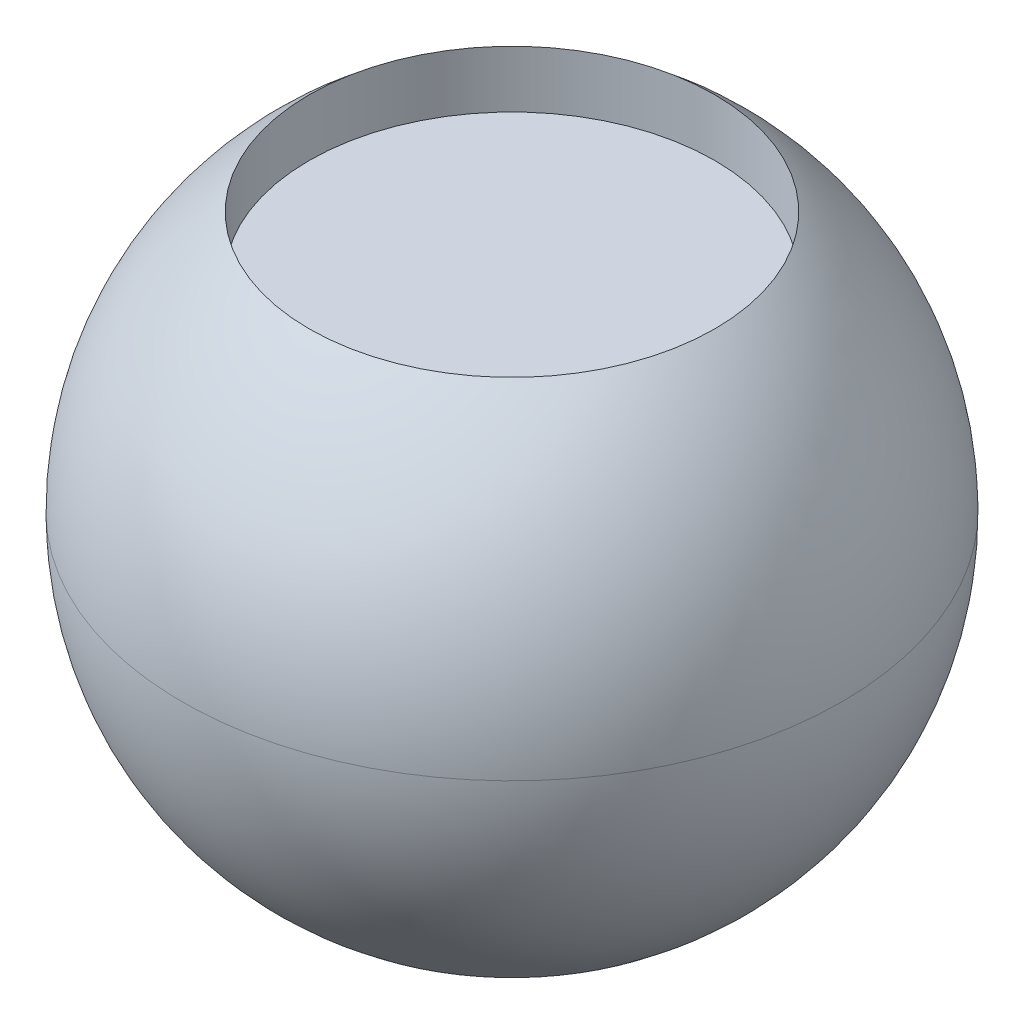
ISO-10303-21;
HEADER;
FILE_DESCRIPTION(('STEP AP214'),'2;1');
FILE_NAME('part.step','',(''),(''),'','','');
FILE_SCHEMA(('AUTOMOTIVE_DESIGN { 1 0 10303 214 1 1 1 1 }'));
ENDSEC;
DATA;
#1=APPLICATION_CONTEXT('core data for automotive mechanical design processes');
#2=APPLICATION_PROTOCOL_DEFINITION('international standard','automotive_design',2000,#1);
#3=PRODUCT_CONTEXT('',#1,'mechanical');
#4=PRODUCT('Part','Part','',(#3));
#5=PRODUCT_RELATED_PRODUCT_CATEGORY('part','',(#4));
#6=PRODUCT_DEFINITION_FORMATION('','',#4);
#7=PRODUCT_DEFINITION_CONTEXT('part definition',#1,'design');
#8=PRODUCT_DEFINITION('design','',#6,#7);
#9=PRODUCT_DEFINITION_SHAPE('','',#8);
#10=(LENGTH_UNIT() NAMED_UNIT(*) SI_UNIT(.MILLI.,.METRE.));
#11=(NAMED_UNIT(*) PLANE_ANGLE_UNIT() SI_UNIT($,.RADIAN.));
#12=(NAMED_UNIT(*) SI_UNIT($,.STERADIAN.) SOLID_ANGLE_UNIT());
#13=UNCERTAINTY_MEASURE_WITH_UNIT(LENGTH_MEASURE(1.E-05),#10,'distance_accuracy_value','');
#14=(GEOMETRIC_REPRESENTATION_CONTEXT(3) GLOBAL_UNCERTAINTY_ASSIGNED_CONTEXT((#13)) GLOBAL_UNIT_ASSIGNED_CONTEXT((#10,
#11,#12)) REPRESENTATION_CONTEXT('',''));
#15=CARTESIAN_POINT('',(0.,0.,0.));
#16=DIRECTION('',(0.,0.,1.));
#17=DIRECTION('',(1.,0.,0.));
#18=AXIS2_PLACEMENT_3D('',#15,#16,#17);
#19=CARTESIAN_POINT('',(-37.5,0.,-32.51));
#20=DIRECTION('',(0.,-1.,0.));
#21=DIRECTION('',(1.,0.,0.));
#22=AXIS2_PLACEMENT_3D('',#19,#20,#21);
#23=PLANE('',#22);
#24=CARTESIAN_POINT('',(0.,0.,0.));
#25=DIRECTION('',(0.,-1.,0.));
#26=DIRECTION('',(1.,0.,0.));
#27=AXIS2_PLACEMENT_3D('',#24,#25,#26);
#28=CIRCLE('',#27,32.5);
#29=CARTESIAN_POINT('',(32.5,0.,0.));
#30=VERTEX_POINT('',#29);
#31=EDGE_CURVE('E53',#30,#30,#28,.T.);
#32=ORIENTED_EDGE('',*,*,#31,.T.);
#33=EDGE_LOOP('',(#32));
#34=FACE_BOUND('',#33,.T.);
#35=CARTESIAN_POINT('',(0.,0.,0.));
#36=DIRECTION('',(0.,-1.,0.));
#37=DIRECTION('',(1.,0.,0.));
#38=AXIS2_PLACEMENT_3D('',#35,#36,#37);
#39=CIRCLE('',#38,29.5);
#40=CARTESIAN_POINT('',(29.5,0.,0.));
#41=VERTEX_POINT('',#40);
#42=EDGE_CURVE('E67',#41,#41,#39,.T.);
#43=ORIENTED_EDGE('',*,*,#42,.F.);
#44=EDGE_LOOP('',(#43));
#45=FACE_BOUND('',#44,.T.);
#46=ADVANCED_FACE('F49',(#34,#45),#23,.T.);
#47=CARTESIAN_POINT('',(0.,17.,0.));
#48=DIRECTION('',(0.,1.,0.));
#49=DIRECTION('',(0.,0.,1.));
#50=AXIS2_PLACEMENT_3D('',#47,#48,#49);
#51=PLANE('',#50);
#52=CARTESIAN_POINT('',(0.,17.,0.));
#53=DIRECTION('',(0.,1.,0.));
#54=DIRECTION('',(0.,0.,1.));
#55=AXIS2_PLACEMENT_3D('',#52,#53,#54);
#56=CIRCLE('',#55,23.);
#57=CARTESIAN_POINT('',(0.,17.,23.));
#58=VERTEX_POINT('',#57);
#59=EDGE_CURVE('E70',#58,#58,#56,.T.);
#60=ORIENTED_EDGE('',*,*,#59,.F.);
#61=EDGE_LOOP('',(#60));
#62=FACE_BOUND('',#61,.T.);
#63=ADVANCED_FACE('F94',(#62),#51,.F.);
#64=CARTESIAN_POINT('',(0.,20.,0.));
#65=DIRECTION('',(0.,1.,0.));
#66=DIRECTION('',(0.,0.,1.));
#67=AXIS2_PLACEMENT_3D('',#64,#65,#66);
#68=CYLINDRICAL_SURFACE('',#67,23.);
#69=ORIENTED_EDGE('',*,*,#59,.T.);
#70=EDGE_LOOP('',(#69));
#71=FACE_BOUND('',#70,.T.);
#72=CARTESIAN_POINT('',(0.,18.4729532019112,0.));
#73=DIRECTION('',(0.,-1.,0.));
#74=DIRECTION('',(0.,0.,-1.));
#75=AXIS2_PLACEMENT_3D('',#72,#73,#74);
#76=CIRCLE('',#75,23.);
#77=CARTESIAN_POINT('',(0.,18.4729532019112,-23.));
#78=VERTEX_POINT('',#77);
#79=EDGE_CURVE('E64',#78,#78,#76,.T.);
#80=ORIENTED_EDGE('',*,*,#79,.T.);
#81=EDGE_LOOP('',(#80));
#82=FACE_BOUND('',#81,.T.);
#83=ADVANCED_FACE('F92',(#71,#82),#68,.T.);
#84=CARTESIAN_POINT('',(0.,0.,0.));
#85=DIRECTION('',(0.,-1.,0.));
#86=DIRECTION('',(1.,0.,0.));
#87=AXIS2_PLACEMENT_3D('',#84,#85,#86);
#88=SPHERICAL_SURFACE('',#87,29.5);
#89=ORIENTED_EDGE('',*,*,#79,.F.);
#90=EDGE_LOOP('',(#89));
#91=FACE_BOUND('',#90,.T.);
#92=ORIENTED_EDGE('',*,*,#42,.T.);
#93=EDGE_LOOP('',(#92));
#94=FACE_BOUND('',#93,.T.);
#95=ADVANCED_FACE('F83',(#91,#94),#88,.F.);
#96=CARTESIAN_POINT('',(0.,0.,0.));
#97=DIRECTION('',(0.,-1.,0.));
#98=DIRECTION('',(1.,0.,0.));
#99=AXIS2_PLACEMENT_3D('',#96,#97,#98);
#100=SPHERICAL_SURFACE('',#99,32.5);
#101=CARTESIAN_POINT('',(0.,25.617376914899,0.));
#102=DIRECTION('',(0.,-1.,0.));
#103=DIRECTION('',(0.,0.,-1.));
#104=AXIS2_PLACEMENT_3D('',#101,#102,#103);
#105=CIRCLE('',#104,20.);
#106=CARTESIAN_POINT('',(0.,25.617376914899,-20.));
#107=VERTEX_POINT('',#106);
#108=EDGE_CURVE('E58',#107,#107,#105,.T.);
#109=ORIENTED_EDGE('',*,*,#108,.T.);
#110=EDGE_LOOP('',(#109));
#111=FACE_BOUND('',#110,.T.);
#112=ORIENTED_EDGE('',*,*,#31,.F.);
#113=EDGE_LOOP('',(#112));
#114=FACE_BOUND('',#113,.T.);
#115=ADVANCED_FACE('F51',(#111,#114),#100,.T.);
#116=CARTESIAN_POINT('',(0.,20.,0.));
#117=DIRECTION('',(0.,1.,0.));
#118=DIRECTION('',(0.,0.,1.));
#119=AXIS2_PLACEMENT_3D('',#116,#117,#118);
#120=CYLINDRICAL_SURFACE('',#119,20.);
#121=CARTESIAN_POINT('',(0.,20.,0.));
#122=DIRECTION('',(0.,1.,0.));
#123=DIRECTION('',(0.,0.,1.));
#124=AXIS2_PLACEMENT_3D('',#121,#122,#123);
#125=CIRCLE('',#124,20.);
#126=CARTESIAN_POINT('',(0.,20.,20.));
#127=VERTEX_POINT('',#126);
#128=EDGE_CURVE('E11',#127,#127,#125,.T.);
#129=ORIENTED_EDGE('',*,*,#128,.F.);
#130=EDGE_LOOP('',(#129));
#131=FACE_BOUND('',#130,.T.);
#132=ORIENTED_EDGE('',*,*,#108,.F.);
#133=EDGE_LOOP('',(#132));
#134=FACE_BOUND('',#133,.T.);
#135=ADVANCED_FACE('F82',(#131,#134),#120,.F.);
#136=CARTESIAN_POINT('',(0.,20.,0.));
#137=DIRECTION('',(0.,1.,0.));
#138=DIRECTION('',(0.,0.,1.));
#139=AXIS2_PLACEMENT_3D('',#136,#137,#138);
#140=PLANE('',#139);
#141=ORIENTED_EDGE('',*,*,#128,.T.);
#142=EDGE_LOOP('',(#141));
#143=FACE_BOUND('',#142,.T.);
#144=ADVANCED_FACE('F89',(#143),#140,.T.);
#145=CLOSED_SHELL('',(#46,#63,#83,#95,#115,#135,#144));
#146=MANIFOLD_SOLID_BREP('B2',#145);
#147=CARTESIAN_POINT('',(-37.5,0.,-32.51));
#148=DIRECTION('',(0.,-1.,0.));
#149=DIRECTION('',(1.,0.,0.));
#150=AXIS2_PLACEMENT_3D('',#147,#148,#149);
#151=PLANE('',#150);
#152=CARTESIAN_POINT('',(0.,0.,0.));
#153=DIRECTION('',(0.,-1.,0.));
#154=DIRECTION('',(1.,0.,0.));
#155=AXIS2_PLACEMENT_3D('',#152,#153,#154);
#156=CIRCLE('',#155,29.5);
#157=CARTESIAN_POINT('',(29.5,0.,0.));
#158=VERTEX_POINT('',#157);
#159=EDGE_CURVE('E48',#158,#158,#156,.T.);
#160=ORIENTED_EDGE('',*,*,#159,.T.);
#161=EDGE_LOOP('',(#160));
#162=FACE_BOUND('',#161,.T.);
#163=CARTESIAN_POINT('',(0.,0.,0.));
#164=DIRECTION('',(0.,-1.,0.));
#165=DIRECTION('',(1.,0.,0.));
#166=AXIS2_PLACEMENT_3D('',#163,#164,#165);
#167=CIRCLE('',#166,32.5);
#168=CARTESIAN_POINT('',(32.5,0.,0.));
#169=VERTEX_POINT('',#168);
#170=EDGE_CURVE('E159',#169,#169,#167,.T.);
#171=ORIENTED_EDGE('',*,*,#170,.F.);
#172=EDGE_LOOP('',(#171));
#173=FACE_BOUND('',#172,.T.);
#174=ADVANCED_FACE('F156',(#162,#173),#151,.F.);
#175=CARTESIAN_POINT('',(0.,0.,0.));
#176=DIRECTION('',(0.,-1.,0.));
#177=DIRECTION('',(1.,0.,0.));
#178=AXIS2_PLACEMENT_3D('',#175,#176,#177);
#179=SPHERICAL_SURFACE('',#178,29.5);
#180=ORIENTED_EDGE('',*,*,#159,.F.);
#181=EDGE_LOOP('',(#180));
#182=FACE_BOUND('',#181,.T.);
#183=ADVANCED_FACE('F171',(#182),#179,.F.);
#184=CARTESIAN_POINT('',(0.,0.,0.));
#185=DIRECTION('',(0.,-1.,0.));
#186=DIRECTION('',(1.,0.,0.));
#187=AXIS2_PLACEMENT_3D('',#184,#185,#186);
#188=SPHERICAL_SURFACE('',#187,32.5);
#189=ORIENTED_EDGE('',*,*,#170,.T.);
#190=EDGE_LOOP('',(#189));
#191=FACE_BOUND('',#190,.T.);
#192=ADVANCED_FACE('F168',(#191),#188,.T.);
#193=CLOSED_SHELL('',(#174,#183,#192));
#194=MANIFOLD_SOLID_BREP('B6',#193);
#195=ADVANCED_BREP_SHAPE_REPRESENTATION('',(#18,#146,#194),#14);
#196=SHAPE_DEFINITION_REPRESENTATION(#9,#195);
ENDSEC;
END-ISO-10303-21;
